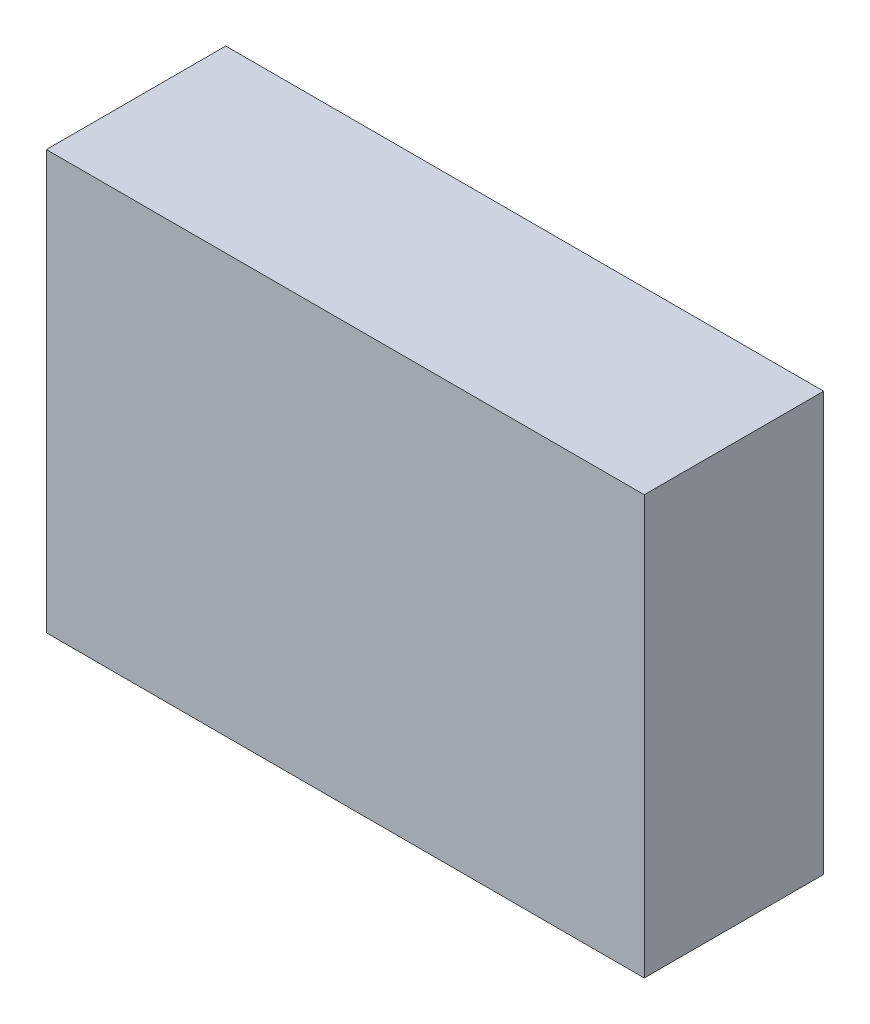
ISO-10303-21;
HEADER;
FILE_DESCRIPTION(('STEP AP214'),'2;1');
FILE_NAME('part.step','',(''),(''),'','','');
FILE_SCHEMA(('AUTOMOTIVE_DESIGN { 1 0 10303 214 1 1 1 1 }'));
ENDSEC;
DATA;
#1=APPLICATION_CONTEXT('core data for automotive mechanical design processes');
#2=APPLICATION_PROTOCOL_DEFINITION('international standard','automotive_design',2000,#1);
#3=PRODUCT_CONTEXT('',#1,'mechanical');
#4=PRODUCT('Part','Part','',(#3));
#5=PRODUCT_RELATED_PRODUCT_CATEGORY('part','',(#4));
#6=PRODUCT_DEFINITION_FORMATION('','',#4);
#7=PRODUCT_DEFINITION_CONTEXT('part definition',#1,'design');
#8=PRODUCT_DEFINITION('design','',#6,#7);
#9=PRODUCT_DEFINITION_SHAPE('','',#8);
#10=(LENGTH_UNIT() NAMED_UNIT(*) SI_UNIT(.MILLI.,.METRE.));
#11=(NAMED_UNIT(*) PLANE_ANGLE_UNIT() SI_UNIT($,.RADIAN.));
#12=(NAMED_UNIT(*) SI_UNIT($,.STERADIAN.) SOLID_ANGLE_UNIT());
#13=UNCERTAINTY_MEASURE_WITH_UNIT(LENGTH_MEASURE(1.E-05),#10,'distance_accuracy_value','');
#14=(GEOMETRIC_REPRESENTATION_CONTEXT(3) GLOBAL_UNCERTAINTY_ASSIGNED_CONTEXT((#13)) GLOBAL_UNIT_ASSIGNED_CONTEXT((#10,
#11,#12)) REPRESENTATION_CONTEXT('',''));
#15=CARTESIAN_POINT('',(0.,0.,0.));
#16=DIRECTION('',(0.,0.,1.));
#17=DIRECTION('',(1.,0.,0.));
#18=AXIS2_PLACEMENT_3D('',#15,#16,#17);
#19=CARTESIAN_POINT('',(0.,0.,300.));
#20=DIRECTION('',(1.,0.,0.));
#21=DIRECTION('',(0.,0.,-1.));
#22=AXIS2_PLACEMENT_3D('',#19,#20,#21);
#23=PLANE('',#22);
#24=DIRECTION('',(0.,-1.,0.));
#25=VECTOR('',#24,1.);
#26=CARTESIAN_POINT('',(0.,0.,0.));
#27=LINE('',#26,#25);
#28=CARTESIAN_POINT('',(0.,700.,0.));
#29=VERTEX_POINT('',#28);
#30=CARTESIAN_POINT('',(0.,0.,0.));
#31=VERTEX_POINT('',#30);
#32=EDGE_CURVE('E107',#29,#31,#27,.T.);
#33=ORIENTED_EDGE('',*,*,#32,.T.);
#34=DIRECTION('',(0.,0.,-1.));
#35=VECTOR('',#34,1.);
#36=CARTESIAN_POINT('',(0.,0.,300.));
#37=LINE('',#36,#35);
#38=CARTESIAN_POINT('',(0.,0.,300.));
#39=VERTEX_POINT('',#38);
#40=EDGE_CURVE('E11',#39,#31,#37,.T.);
#41=ORIENTED_EDGE('',*,*,#40,.F.);
#42=DIRECTION('',(0.,-1.,0.));
#43=VECTOR('',#42,1.);
#44=CARTESIAN_POINT('',(0.,0.,300.));
#45=LINE('',#44,#43);
#46=CARTESIAN_POINT('',(0.,700.,300.));
#47=VERTEX_POINT('',#46);
#48=EDGE_CURVE('E91',#47,#39,#45,.T.);
#49=ORIENTED_EDGE('',*,*,#48,.F.);
#50=DIRECTION('',(0.,0.,-1.));
#51=VECTOR('',#50,1.);
#52=CARTESIAN_POINT('',(0.,700.,300.));
#53=LINE('',#52,#51);
#54=EDGE_CURVE('E103',#47,#29,#53,.T.);
#55=ORIENTED_EDGE('',*,*,#54,.T.);
#56=EDGE_LOOP('',(#33,#41,#49,#55));
#57=FACE_BOUND('',#56,.T.);
#58=ADVANCED_FACE('F39',(#57),#23,.F.);
#59=CARTESIAN_POINT('',(0.,0.,300.));
#60=DIRECTION('',(0.,1.,0.));
#61=DIRECTION('',(0.,0.,1.));
#62=AXIS2_PLACEMENT_3D('',#59,#60,#61);
#63=PLANE('',#62);
#64=DIRECTION('',(1.,0.,0.));
#65=VECTOR('',#64,1.);
#66=CARTESIAN_POINT('',(0.,0.,0.));
#67=LINE('',#66,#65);
#68=CARTESIAN_POINT('',(1000.,0.,0.));
#69=VERTEX_POINT('',#68);
#70=EDGE_CURVE('E96',#31,#69,#67,.T.);
#71=ORIENTED_EDGE('',*,*,#70,.T.);
#72=DIRECTION('',(0.,0.,-1.));
#73=VECTOR('',#72,1.);
#74=CARTESIAN_POINT('',(1000.,0.,300.));
#75=LINE('',#74,#73);
#76=CARTESIAN_POINT('',(1000.,0.,300.));
#77=VERTEX_POINT('',#76);
#78=EDGE_CURVE('E48',#77,#69,#75,.T.);
#79=ORIENTED_EDGE('',*,*,#78,.F.);
#80=DIRECTION('',(1.,0.,0.));
#81=VECTOR('',#80,1.);
#82=CARTESIAN_POINT('',(0.,0.,300.));
#83=LINE('',#82,#81);
#84=EDGE_CURVE('E86',#39,#77,#83,.T.);
#85=ORIENTED_EDGE('',*,*,#84,.F.);
#86=ORIENTED_EDGE('',*,*,#40,.T.);
#87=EDGE_LOOP('',(#71,#79,#85,#86));
#88=FACE_BOUND('',#87,.T.);
#89=ADVANCED_FACE('F95',(#88),#63,.F.);
#90=CARTESIAN_POINT('',(1000.,0.,300.));
#91=DIRECTION('',(-1.,0.,0.));
#92=DIRECTION('',(0.,0.,1.));
#93=AXIS2_PLACEMENT_3D('',#90,#91,#92);
#94=PLANE('',#93);
#95=DIRECTION('',(0.,1.,0.));
#96=VECTOR('',#95,1.);
#97=CARTESIAN_POINT('',(1000.,0.,0.));
#98=LINE('',#97,#96);
#99=CARTESIAN_POINT('',(1000.,700.,0.));
#100=VERTEX_POINT('',#99);
#101=EDGE_CURVE('E73',#69,#100,#98,.T.);
#102=ORIENTED_EDGE('',*,*,#101,.T.);
#103=DIRECTION('',(0.,0.,-1.));
#104=VECTOR('',#103,1.);
#105=CARTESIAN_POINT('',(1000.,700.,300.));
#106=LINE('',#105,#104);
#107=CARTESIAN_POINT('',(1000.,700.,300.));
#108=VERTEX_POINT('',#107);
#109=EDGE_CURVE('E98',#108,#100,#106,.T.);
#110=ORIENTED_EDGE('',*,*,#109,.F.);
#111=DIRECTION('',(0.,1.,0.));
#112=VECTOR('',#111,1.);
#113=CARTESIAN_POINT('',(1000.,0.,300.));
#114=LINE('',#113,#112);
#115=EDGE_CURVE('E89',#77,#108,#114,.T.);
#116=ORIENTED_EDGE('',*,*,#115,.F.);
#117=ORIENTED_EDGE('',*,*,#78,.T.);
#118=EDGE_LOOP('',(#102,#110,#116,#117));
#119=FACE_BOUND('',#118,.T.);
#120=ADVANCED_FACE('F99',(#119),#94,.F.);
#121=CARTESIAN_POINT('',(0.,700.,300.));
#122=DIRECTION('',(0.,-1.,0.));
#123=DIRECTION('',(0.,0.,-1.));
#124=AXIS2_PLACEMENT_3D('',#121,#122,#123);
#125=PLANE('',#124);
#126=DIRECTION('',(-1.,0.,0.));
#127=VECTOR('',#126,1.);
#128=CARTESIAN_POINT('',(0.,700.,0.));
#129=LINE('',#128,#127);
#130=EDGE_CURVE('E79',#100,#29,#129,.T.);
#131=ORIENTED_EDGE('',*,*,#130,.T.);
#132=ORIENTED_EDGE('',*,*,#54,.F.);
#133=DIRECTION('',(-1.,0.,0.));
#134=VECTOR('',#133,1.);
#135=CARTESIAN_POINT('',(0.,700.,300.));
#136=LINE('',#135,#134);
#137=EDGE_CURVE('E56',#108,#47,#136,.T.);
#138=ORIENTED_EDGE('',*,*,#137,.F.);
#139=ORIENTED_EDGE('',*,*,#109,.T.);
#140=EDGE_LOOP('',(#131,#132,#138,#139));
#141=FACE_BOUND('',#140,.T.);
#142=ADVANCED_FACE('F120',(#141),#125,.F.);
#143=CARTESIAN_POINT('',(0.,0.,300.));
#144=DIRECTION('',(0.,0.,-1.));
#145=DIRECTION('',(-1.,0.,0.));
#146=AXIS2_PLACEMENT_3D('',#143,#144,#145);
#147=PLANE('',#146);
#148=ORIENTED_EDGE('',*,*,#48,.T.);
#149=ORIENTED_EDGE('',*,*,#84,.T.);
#150=ORIENTED_EDGE('',*,*,#115,.T.);
#151=ORIENTED_EDGE('',*,*,#137,.T.);
#152=EDGE_LOOP('',(#148,#149,#150,#151));
#153=FACE_BOUND('',#152,.T.);
#154=ADVANCED_FACE('F87',(#153),#147,.F.);
#155=CARTESIAN_POINT('',(0.,0.,0.));
#156=DIRECTION('',(0.,0.,-1.));
#157=DIRECTION('',(-1.,0.,0.));
#158=AXIS2_PLACEMENT_3D('',#155,#156,#157);
#159=PLANE('',#158);
#160=ORIENTED_EDGE('',*,*,#32,.F.);
#161=ORIENTED_EDGE('',*,*,#130,.F.);
#162=ORIENTED_EDGE('',*,*,#101,.F.);
#163=ORIENTED_EDGE('',*,*,#70,.F.);
#164=EDGE_LOOP('',(#160,#161,#162,#163));
#165=FACE_BOUND('',#164,.T.);
#166=ADVANCED_FACE('F123',(#165),#159,.T.);
#167=CLOSED_SHELL('',(#58,#89,#120,#142,#154,#166));
#168=MANIFOLD_SOLID_BREP('B2',#167);
#169=ADVANCED_BREP_SHAPE_REPRESENTATION('',(#18,#168),#14);
#170=SHAPE_DEFINITION_REPRESENTATION(#9,#169);
ENDSEC;
END-ISO-10303-21;
